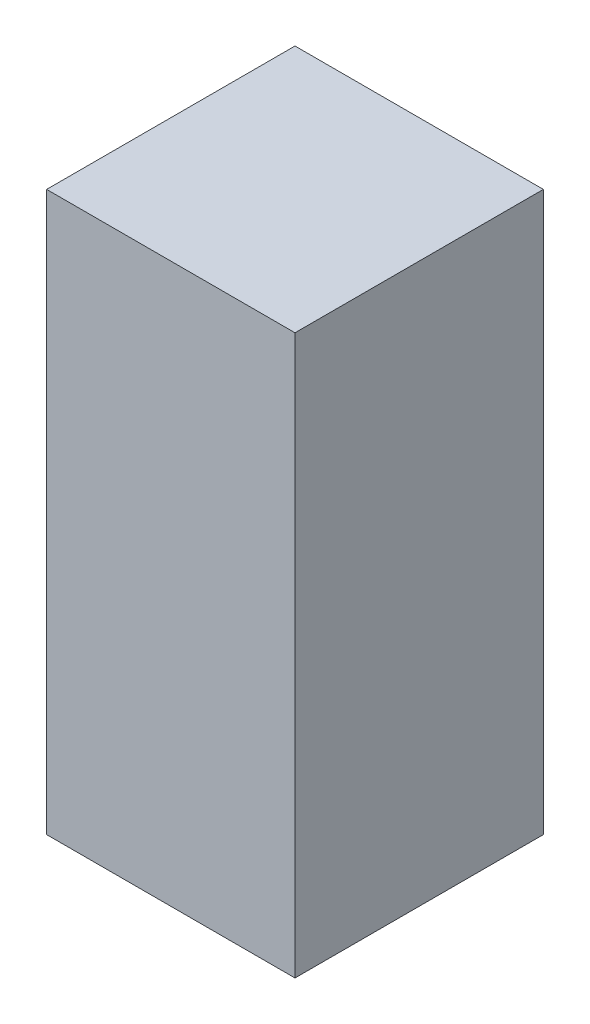
ISO-10303-21;
HEADER;
FILE_DESCRIPTION(('STEP AP214'),'2;1');
FILE_NAME('part.step','',(''),(''),'','','');
FILE_SCHEMA(('AUTOMOTIVE_DESIGN { 1 0 10303 214 1 1 1 1 }'));
ENDSEC;
DATA;
#1=APPLICATION_CONTEXT('core data for automotive mechanical design processes');
#2=APPLICATION_PROTOCOL_DEFINITION('international standard','automotive_design',2000,#1);
#3=PRODUCT_CONTEXT('',#1,'mechanical');
#4=PRODUCT('Part','Part','',(#3));
#5=PRODUCT_RELATED_PRODUCT_CATEGORY('part','',(#4));
#6=PRODUCT_DEFINITION_FORMATION('','',#4);
#7=PRODUCT_DEFINITION_CONTEXT('part definition',#1,'design');
#8=PRODUCT_DEFINITION('design','',#6,#7);
#9=PRODUCT_DEFINITION_SHAPE('','',#8);
#10=(LENGTH_UNIT() NAMED_UNIT(*) SI_UNIT(.MILLI.,.METRE.));
#11=(NAMED_UNIT(*) PLANE_ANGLE_UNIT() SI_UNIT($,.RADIAN.));
#12=(NAMED_UNIT(*) SI_UNIT($,.STERADIAN.) SOLID_ANGLE_UNIT());
#13=UNCERTAINTY_MEASURE_WITH_UNIT(LENGTH_MEASURE(1.E-05),#10,'distance_accuracy_value','');
#14=(GEOMETRIC_REPRESENTATION_CONTEXT(3) GLOBAL_UNCERTAINTY_ASSIGNED_CONTEXT((#13)) GLOBAL_UNIT_ASSIGNED_CONTEXT((#10,
#11,#12)) REPRESENTATION_CONTEXT('',''));
#15=CARTESIAN_POINT('',(0.,0.,0.));
#16=DIRECTION('',(0.,0.,1.));
#17=DIRECTION('',(1.,0.,0.));
#18=AXIS2_PLACEMENT_3D('',#15,#16,#17);
#19=CARTESIAN_POINT('',(502.5,552.,-572.5));
#20=DIRECTION('',(-1.,0.,0.));
#21=DIRECTION('',(0.,0.,1.));
#22=AXIS2_PLACEMENT_3D('',#19,#20,#21);
#23=PLANE('',#22);
#24=DIRECTION('',(0.,-1.,0.));
#25=VECTOR('',#24,1.);
#26=CARTESIAN_POINT('',(502.5,552.,-552.5));
#27=LINE('',#26,#25);
#28=CARTESIAN_POINT('',(502.5,597.,-552.5));
#29=VERTEX_POINT('',#28);
#30=CARTESIAN_POINT('',(502.5,552.,-552.5));
#31=VERTEX_POINT('',#30);
#32=EDGE_CURVE('E103',#29,#31,#27,.T.);
#33=ORIENTED_EDGE('',*,*,#32,.F.);
#34=DIRECTION('',(0.,0.,1.));
#35=VECTOR('',#34,1.);
#36=CARTESIAN_POINT('',(502.5,597.,-572.5));
#37=LINE('',#36,#35);
#38=CARTESIAN_POINT('',(502.5,597.,-572.5));
#39=VERTEX_POINT('',#38);
#40=EDGE_CURVE('E11',#39,#29,#37,.T.);
#41=ORIENTED_EDGE('',*,*,#40,.F.);
#42=DIRECTION('',(0.,-1.,0.));
#43=VECTOR('',#42,1.);
#44=CARTESIAN_POINT('',(502.5,552.,-572.5));
#45=LINE('',#44,#43);
#46=CARTESIAN_POINT('',(502.5,552.,-572.5));
#47=VERTEX_POINT('',#46);
#48=EDGE_CURVE('E97',#39,#47,#45,.T.);
#49=ORIENTED_EDGE('',*,*,#48,.T.);
#50=DIRECTION('',(0.,0.,1.));
#51=VECTOR('',#50,1.);
#52=CARTESIAN_POINT('',(502.5,552.,-572.5));
#53=LINE('',#52,#51);
#54=EDGE_CURVE('E42',#47,#31,#53,.T.);
#55=ORIENTED_EDGE('',*,*,#54,.T.);
#56=EDGE_LOOP('',(#33,#41,#49,#55));
#57=FACE_BOUND('',#56,.T.);
#58=ADVANCED_FACE('F39',(#57),#23,.T.);
#59=CARTESIAN_POINT('',(502.5,597.,-572.5));
#60=DIRECTION('',(0.,1.,0.));
#61=DIRECTION('',(0.,0.,1.));
#62=AXIS2_PLACEMENT_3D('',#59,#60,#61);
#63=PLANE('',#62);
#64=DIRECTION('',(-1.,0.,0.));
#65=VECTOR('',#64,1.);
#66=CARTESIAN_POINT('',(502.5,597.,-552.5));
#67=LINE('',#66,#65);
#68=CARTESIAN_POINT('',(522.5,597.,-552.5));
#69=VERTEX_POINT('',#68);
#70=EDGE_CURVE('E99',#69,#29,#67,.T.);
#71=ORIENTED_EDGE('',*,*,#70,.F.);
#72=DIRECTION('',(0.,0.,1.));
#73=VECTOR('',#72,1.);
#74=CARTESIAN_POINT('',(522.5,597.,-572.5));
#75=LINE('',#74,#73);
#76=CARTESIAN_POINT('',(522.5,597.,-572.5));
#77=VERTEX_POINT('',#76);
#78=EDGE_CURVE('E48',#77,#69,#75,.T.);
#79=ORIENTED_EDGE('',*,*,#78,.F.);
#80=DIRECTION('',(-1.,0.,0.));
#81=VECTOR('',#80,1.);
#82=CARTESIAN_POINT('',(502.5,597.,-572.5));
#83=LINE('',#82,#81);
#84=EDGE_CURVE('E94',#77,#39,#83,.T.);
#85=ORIENTED_EDGE('',*,*,#84,.T.);
#86=ORIENTED_EDGE('',*,*,#40,.T.);
#87=EDGE_LOOP('',(#71,#79,#85,#86));
#88=FACE_BOUND('',#87,.T.);
#89=ADVANCED_FACE('F113',(#88),#63,.T.);
#90=CARTESIAN_POINT('',(522.5,552.,-572.5));
#91=DIRECTION('',(1.,0.,0.));
#92=DIRECTION('',(0.,0.,-1.));
#93=AXIS2_PLACEMENT_3D('',#90,#91,#92);
#94=PLANE('',#93);
#95=DIRECTION('',(0.,1.,0.));
#96=VECTOR('',#95,1.);
#97=CARTESIAN_POINT('',(522.5,552.,-552.5));
#98=LINE('',#97,#96);
#99=CARTESIAN_POINT('',(522.5,552.,-552.5));
#100=VERTEX_POINT('',#99);
#101=EDGE_CURVE('E89',#100,#69,#98,.T.);
#102=ORIENTED_EDGE('',*,*,#101,.F.);
#103=DIRECTION('',(0.,0.,1.));
#104=VECTOR('',#103,1.);
#105=CARTESIAN_POINT('',(522.5,552.,-572.5));
#106=LINE('',#105,#104);
#107=CARTESIAN_POINT('',(522.5,552.,-572.5));
#108=VERTEX_POINT('',#107);
#109=EDGE_CURVE('E84',#108,#100,#106,.T.);
#110=ORIENTED_EDGE('',*,*,#109,.F.);
#111=DIRECTION('',(0.,1.,0.));
#112=VECTOR('',#111,1.);
#113=CARTESIAN_POINT('',(522.5,552.,-572.5));
#114=LINE('',#113,#112);
#115=EDGE_CURVE('E87',#108,#77,#114,.T.);
#116=ORIENTED_EDGE('',*,*,#115,.T.);
#117=ORIENTED_EDGE('',*,*,#78,.T.);
#118=EDGE_LOOP('',(#102,#110,#116,#117));
#119=FACE_BOUND('',#118,.T.);
#120=ADVANCED_FACE('F86',(#119),#94,.T.);
#121=CARTESIAN_POINT('',(502.5,552.,-572.5));
#122=DIRECTION('',(0.,-1.,0.));
#123=DIRECTION('',(0.,0.,-1.));
#124=AXIS2_PLACEMENT_3D('',#121,#122,#123);
#125=PLANE('',#124);
#126=DIRECTION('',(1.,0.,0.));
#127=VECTOR('',#126,1.);
#128=CARTESIAN_POINT('',(502.5,552.,-552.5));
#129=LINE('',#128,#127);
#130=EDGE_CURVE('E106',#31,#100,#129,.T.);
#131=ORIENTED_EDGE('',*,*,#130,.F.);
#132=ORIENTED_EDGE('',*,*,#54,.F.);
#133=DIRECTION('',(1.,0.,0.));
#134=VECTOR('',#133,1.);
#135=CARTESIAN_POINT('',(502.5,552.,-572.5));
#136=LINE('',#135,#134);
#137=EDGE_CURVE('E93',#47,#108,#136,.T.);
#138=ORIENTED_EDGE('',*,*,#137,.T.);
#139=ORIENTED_EDGE('',*,*,#109,.T.);
#140=EDGE_LOOP('',(#131,#132,#138,#139));
#141=FACE_BOUND('',#140,.T.);
#142=ADVANCED_FACE('F96',(#141),#125,.T.);
#143=CARTESIAN_POINT('',(0.,0.,-572.5));
#144=DIRECTION('',(0.,0.,-1.));
#145=DIRECTION('',(-1.,0.,0.));
#146=AXIS2_PLACEMENT_3D('',#143,#144,#145);
#147=PLANE('',#146);
#148=ORIENTED_EDGE('',*,*,#48,.F.);
#149=ORIENTED_EDGE('',*,*,#84,.F.);
#150=ORIENTED_EDGE('',*,*,#115,.F.);
#151=ORIENTED_EDGE('',*,*,#137,.F.);
#152=EDGE_LOOP('',(#148,#149,#150,#151));
#153=FACE_BOUND('',#152,.T.);
#154=ADVANCED_FACE('F92',(#153),#147,.T.);
#155=CARTESIAN_POINT('',(0.,0.,-552.5));
#156=DIRECTION('',(0.,0.,-1.));
#157=DIRECTION('',(-1.,0.,0.));
#158=AXIS2_PLACEMENT_3D('',#155,#156,#157);
#159=PLANE('',#158);
#160=ORIENTED_EDGE('',*,*,#32,.T.);
#161=ORIENTED_EDGE('',*,*,#130,.T.);
#162=ORIENTED_EDGE('',*,*,#101,.T.);
#163=ORIENTED_EDGE('',*,*,#70,.T.);
#164=EDGE_LOOP('',(#160,#161,#162,#163));
#165=FACE_BOUND('',#164,.T.);
#166=ADVANCED_FACE('F112',(#165),#159,.F.);
#167=CLOSED_SHELL('',(#58,#89,#120,#142,#154,#166));
#168=MANIFOLD_SOLID_BREP('B2',#167);
#169=ADVANCED_BREP_SHAPE_REPRESENTATION('',(#18,#168),#14);
#170=SHAPE_DEFINITION_REPRESENTATION(#9,#169);
ENDSEC;
END-ISO-10303-21;
